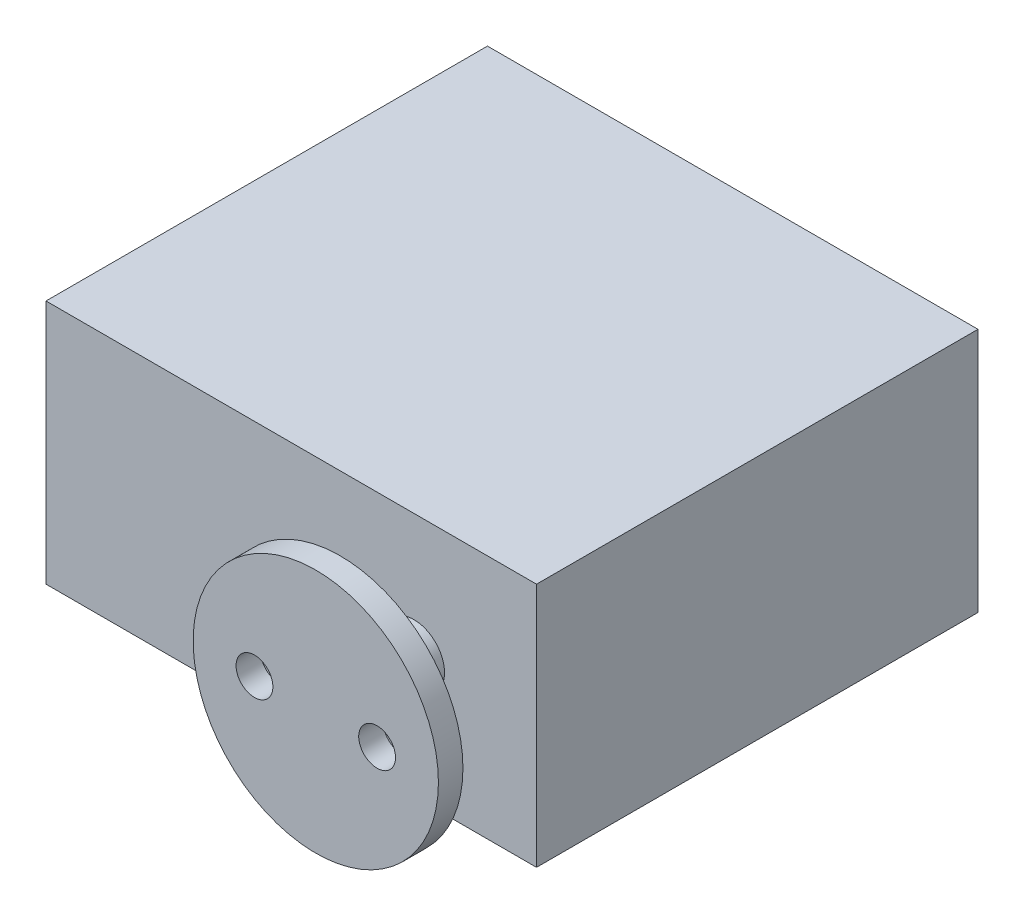
ISO-10303-21;
HEADER;
FILE_DESCRIPTION(('STEP AP214'),'2;1');
FILE_NAME('part.step','',(''),(''),'','','');
FILE_SCHEMA(('AUTOMOTIVE_DESIGN { 1 0 10303 214 1 1 1 1 }'));
ENDSEC;
DATA;
#1=APPLICATION_CONTEXT('core data for automotive mechanical design processes');
#2=APPLICATION_PROTOCOL_DEFINITION('international standard','automotive_design',2000,#1);
#3=PRODUCT_CONTEXT('',#1,'mechanical');
#4=PRODUCT('Part','Part','',(#3));
#5=PRODUCT_RELATED_PRODUCT_CATEGORY('part','',(#4));
#6=PRODUCT_DEFINITION_FORMATION('','',#4);
#7=PRODUCT_DEFINITION_CONTEXT('part definition',#1,'design');
#8=PRODUCT_DEFINITION('design','',#6,#7);
#9=PRODUCT_DEFINITION_SHAPE('','',#8);
#10=(LENGTH_UNIT() NAMED_UNIT(*) SI_UNIT(.MILLI.,.METRE.));
#11=(NAMED_UNIT(*) PLANE_ANGLE_UNIT() SI_UNIT($,.RADIAN.));
#12=(NAMED_UNIT(*) SI_UNIT($,.STERADIAN.) SOLID_ANGLE_UNIT());
#13=UNCERTAINTY_MEASURE_WITH_UNIT(LENGTH_MEASURE(1.E-05),#10,'distance_accuracy_value','');
#14=(GEOMETRIC_REPRESENTATION_CONTEXT(3) GLOBAL_UNCERTAINTY_ASSIGNED_CONTEXT((#13)) GLOBAL_UNIT_ASSIGNED_CONTEXT((#10,
#11,#12)) REPRESENTATION_CONTEXT('',''));
#15=CARTESIAN_POINT('',(0.,0.,0.));
#16=DIRECTION('',(0.,0.,1.));
#17=DIRECTION('',(1.,0.,0.));
#18=AXIS2_PLACEMENT_3D('',#15,#16,#17);
#19=CARTESIAN_POINT('',(-20.,10.,36.));
#20=DIRECTION('',(1.,0.,0.));
#21=DIRECTION('',(0.,1.,0.));
#22=AXIS2_PLACEMENT_3D('',#19,#20,#21);
#23=PLANE('',#22);
#24=DIRECTION('',(0.,-1.,0.));
#25=VECTOR('',#24,1.);
#26=CARTESIAN_POINT('',(-20.,10.,0.));
#27=LINE('',#26,#25);
#28=CARTESIAN_POINT('',(-20.,10.,0.));
#29=VERTEX_POINT('',#28);
#30=CARTESIAN_POINT('',(-20.,-10.,0.));
#31=VERTEX_POINT('',#30);
#32=EDGE_CURVE('E110',#29,#31,#27,.T.);
#33=ORIENTED_EDGE('',*,*,#32,.T.);
#34=DIRECTION('',(0.,0.,-1.));
#35=VECTOR('',#34,1.);
#36=CARTESIAN_POINT('',(-20.,-10.,36.));
#37=LINE('',#36,#35);
#38=CARTESIAN_POINT('',(-20.,-10.,36.));
#39=VERTEX_POINT('',#38);
#40=EDGE_CURVE('E48',#39,#31,#37,.T.);
#41=ORIENTED_EDGE('',*,*,#40,.F.);
#42=DIRECTION('',(0.,-1.,0.));
#43=VECTOR('',#42,1.);
#44=CARTESIAN_POINT('',(-20.,10.,36.));
#45=LINE('',#44,#43);
#46=CARTESIAN_POINT('',(-20.,10.,36.));
#47=VERTEX_POINT('',#46);
#48=EDGE_CURVE('E92',#47,#39,#45,.T.);
#49=ORIENTED_EDGE('',*,*,#48,.F.);
#50=DIRECTION('',(0.,0.,-1.));
#51=VECTOR('',#50,1.);
#52=CARTESIAN_POINT('',(-20.,10.,36.));
#53=LINE('',#52,#51);
#54=EDGE_CURVE('E106',#47,#29,#53,.T.);
#55=ORIENTED_EDGE('',*,*,#54,.T.);
#56=EDGE_LOOP('',(#33,#41,#49,#55));
#57=FACE_BOUND('',#56,.T.);
#58=ADVANCED_FACE('F39',(#57),#23,.F.);
#59=CARTESIAN_POINT('',(20.,-10.,36.));
#60=DIRECTION('',(0.,1.,0.));
#61=DIRECTION('',(-1.,0.,0.));
#62=AXIS2_PLACEMENT_3D('',#59,#60,#61);
#63=PLANE('',#62);
#64=DIRECTION('',(1.,0.,0.));
#65=VECTOR('',#64,1.);
#66=CARTESIAN_POINT('',(20.,-10.,0.));
#67=LINE('',#66,#65);
#68=CARTESIAN_POINT('',(20.,-10.,0.));
#69=VERTEX_POINT('',#68);
#70=EDGE_CURVE('E98',#31,#69,#67,.T.);
#71=ORIENTED_EDGE('',*,*,#70,.T.);
#72=DIRECTION('',(0.,0.,-1.));
#73=VECTOR('',#72,1.);
#74=CARTESIAN_POINT('',(20.,-10.,36.));
#75=LINE('',#74,#73);
#76=CARTESIAN_POINT('',(20.,-10.,36.));
#77=VERTEX_POINT('',#76);
#78=EDGE_CURVE('E96',#77,#69,#75,.T.);
#79=ORIENTED_EDGE('',*,*,#78,.F.);
#80=DIRECTION('',(1.,0.,0.));
#81=VECTOR('',#80,1.);
#82=CARTESIAN_POINT('',(20.,-10.,36.));
#83=LINE('',#82,#81);
#84=EDGE_CURVE('E87',#39,#77,#83,.T.);
#85=ORIENTED_EDGE('',*,*,#84,.F.);
#86=ORIENTED_EDGE('',*,*,#40,.T.);
#87=EDGE_LOOP('',(#71,#79,#85,#86));
#88=FACE_BOUND('',#87,.T.);
#89=ADVANCED_FACE('F97',(#88),#63,.F.);
#90=CARTESIAN_POINT('',(20.,10.,36.));
#91=DIRECTION('',(-1.,0.,0.));
#92=DIRECTION('',(0.,0.,1.));
#93=AXIS2_PLACEMENT_3D('',#90,#91,#92);
#94=PLANE('',#93);
#95=DIRECTION('',(0.,1.,0.));
#96=VECTOR('',#95,1.);
#97=CARTESIAN_POINT('',(20.,10.,0.));
#98=LINE('',#97,#96);
#99=CARTESIAN_POINT('',(20.,10.,0.));
#100=VERTEX_POINT('',#99);
#101=EDGE_CURVE('E73',#69,#100,#98,.T.);
#102=ORIENTED_EDGE('',*,*,#101,.T.);
#103=DIRECTION('',(0.,0.,-1.));
#104=VECTOR('',#103,1.);
#105=CARTESIAN_POINT('',(20.,10.,36.));
#106=LINE('',#105,#104);
#107=CARTESIAN_POINT('',(20.,10.,36.));
#108=VERTEX_POINT('',#107);
#109=EDGE_CURVE('E100',#108,#100,#106,.T.);
#110=ORIENTED_EDGE('',*,*,#109,.F.);
#111=DIRECTION('',(0.,1.,0.));
#112=VECTOR('',#111,1.);
#113=CARTESIAN_POINT('',(20.,10.,36.));
#114=LINE('',#113,#112);
#115=EDGE_CURVE('E90',#77,#108,#114,.T.);
#116=ORIENTED_EDGE('',*,*,#115,.F.);
#117=ORIENTED_EDGE('',*,*,#78,.T.);
#118=EDGE_LOOP('',(#102,#110,#116,#117));
#119=FACE_BOUND('',#118,.T.);
#120=ADVANCED_FACE('F102',(#119),#94,.F.);
#121=CARTESIAN_POINT('',(20.,10.,36.));
#122=DIRECTION('',(0.,-1.,0.));
#123=DIRECTION('',(1.,0.,0.));
#124=AXIS2_PLACEMENT_3D('',#121,#122,#123);
#125=PLANE('',#124);
#126=DIRECTION('',(-1.,0.,0.));
#127=VECTOR('',#126,1.);
#128=CARTESIAN_POINT('',(20.,10.,0.));
#129=LINE('',#128,#127);
#130=EDGE_CURVE('E79',#100,#29,#129,.T.);
#131=ORIENTED_EDGE('',*,*,#130,.T.);
#132=ORIENTED_EDGE('',*,*,#54,.F.);
#133=DIRECTION('',(-1.,0.,0.));
#134=VECTOR('',#133,1.);
#135=CARTESIAN_POINT('',(20.,10.,36.));
#136=LINE('',#135,#134);
#137=EDGE_CURVE('E56',#108,#47,#136,.T.);
#138=ORIENTED_EDGE('',*,*,#137,.F.);
#139=ORIENTED_EDGE('',*,*,#109,.T.);
#140=EDGE_LOOP('',(#131,#132,#138,#139));
#141=FACE_BOUND('',#140,.T.);
#142=ADVANCED_FACE('F139',(#141),#125,.F.);
#143=CARTESIAN_POINT('',(0.,0.,36.));
#144=DIRECTION('',(0.,0.,-1.));
#145=DIRECTION('',(-1.,0.,0.));
#146=AXIS2_PLACEMENT_3D('',#143,#144,#145);
#147=PLANE('',#146);
#148=CARTESIAN_POINT('',(10.,0.,36.));
#149=DIRECTION('',(0.,0.,-1.));
#150=DIRECTION('',(-1.,0.,0.));
#151=AXIS2_PLACEMENT_3D('',#148,#149,#150);
#152=CIRCLE('',#151,2.5);
#153=CARTESIAN_POINT('',(7.5,0.,36.));
#154=VERTEX_POINT('',#153);
#155=EDGE_CURVE('E11',#154,#154,#152,.F.);
#156=ORIENTED_EDGE('',*,*,#155,.F.);
#157=EDGE_LOOP('',(#156));
#158=FACE_BOUND('',#157,.T.);
#159=ORIENTED_EDGE('',*,*,#48,.T.);
#160=ORIENTED_EDGE('',*,*,#84,.T.);
#161=ORIENTED_EDGE('',*,*,#115,.T.);
#162=ORIENTED_EDGE('',*,*,#137,.T.);
#163=EDGE_LOOP('',(#159,#160,#161,#162));
#164=FACE_BOUND('',#163,.T.);
#165=ADVANCED_FACE('F88',(#158,#164),#147,.F.);
#166=CARTESIAN_POINT('',(0.,0.,0.));
#167=DIRECTION('',(0.,0.,-1.));
#168=DIRECTION('',(-1.,0.,0.));
#169=AXIS2_PLACEMENT_3D('',#166,#167,#168);
#170=PLANE('',#169);
#171=ORIENTED_EDGE('',*,*,#32,.F.);
#172=ORIENTED_EDGE('',*,*,#130,.F.);
#173=ORIENTED_EDGE('',*,*,#101,.F.);
#174=ORIENTED_EDGE('',*,*,#70,.F.);
#175=EDGE_LOOP('',(#171,#172,#173,#174));
#176=FACE_BOUND('',#175,.T.);
#177=ADVANCED_FACE('F128',(#176),#170,.T.);
#178=CARTESIAN_POINT('',(10.,0.,42.));
#179=DIRECTION('',(0.,0.,-1.));
#180=DIRECTION('',(-1.,0.,0.));
#181=AXIS2_PLACEMENT_3D('',#178,#179,#180);
#182=CYLINDRICAL_SURFACE('',#181,2.5);
#183=CARTESIAN_POINT('',(10.,0.,42.));
#184=DIRECTION('',(0.,0.,1.));
#185=DIRECTION('',(1.,0.,0.));
#186=AXIS2_PLACEMENT_3D('',#183,#184,#185);
#187=CIRCLE('',#186,2.5);
#188=CARTESIAN_POINT('',(12.5,0.,42.));
#189=VERTEX_POINT('',#188);
#190=EDGE_CURVE('E114',#189,#189,#187,.T.);
#191=ORIENTED_EDGE('',*,*,#190,.F.);
#192=EDGE_LOOP('',(#191));
#193=FACE_BOUND('',#192,.T.);
#194=ORIENTED_EDGE('',*,*,#155,.T.);
#195=EDGE_LOOP('',(#194));
#196=FACE_BOUND('',#195,.T.);
#197=ADVANCED_FACE('F130',(#193,#196),#182,.T.);
#198=CARTESIAN_POINT('',(10.,0.,44.));
#199=DIRECTION('',(0.,0.,1.));
#200=DIRECTION('',(1.,0.,0.));
#201=AXIS2_PLACEMENT_3D('',#198,#199,#200);
#202=PLANE('',#201);
#203=CARTESIAN_POINT('',(5.,0.,44.));
#204=DIRECTION('',(0.,0.,1.));
#205=DIRECTION('',(1.,0.,0.));
#206=AXIS2_PLACEMENT_3D('',#203,#204,#205);
#207=CIRCLE('',#206,1.5);
#208=CARTESIAN_POINT('',(6.5,0.,44.));
#209=VERTEX_POINT('',#208);
#210=EDGE_CURVE('E235',#209,#209,#207,.T.);
#211=ORIENTED_EDGE('',*,*,#210,.F.);
#212=EDGE_LOOP('',(#211));
#213=FACE_BOUND('',#212,.T.);
#214=CARTESIAN_POINT('',(10.,0.,44.));
#215=DIRECTION('',(0.,0.,1.));
#216=DIRECTION('',(1.,0.,0.));
#217=AXIS2_PLACEMENT_3D('',#214,#215,#216);
#218=CIRCLE('',#217,10.);
#219=CARTESIAN_POINT('',(20.,0.,44.));
#220=VERTEX_POINT('',#219);
#221=EDGE_CURVE('E243',#220,#220,#218,.T.);
#222=ORIENTED_EDGE('',*,*,#221,.T.);
#223=EDGE_LOOP('',(#222));
#224=FACE_BOUND('',#223,.T.);
#225=CARTESIAN_POINT('',(15.,0.,44.));
#226=DIRECTION('',(0.,0.,1.));
#227=DIRECTION('',(1.,0.,0.));
#228=AXIS2_PLACEMENT_3D('',#225,#226,#227);
#229=CIRCLE('',#228,1.5);
#230=CARTESIAN_POINT('',(16.5,0.,44.));
#231=VERTEX_POINT('',#230);
#232=EDGE_CURVE('E224',#231,#231,#229,.T.);
#233=ORIENTED_EDGE('',*,*,#232,.F.);
#234=EDGE_LOOP('',(#233));
#235=FACE_BOUND('',#234,.T.);
#236=ADVANCED_FACE('F136',(#213,#224,#235),#202,.T.);
#237=CARTESIAN_POINT('',(10.,0.,42.));
#238=DIRECTION('',(0.,0.,1.));
#239=DIRECTION('',(1.,0.,0.));
#240=AXIS2_PLACEMENT_3D('',#237,#238,#239);
#241=PLANE('',#240);
#242=ORIENTED_EDGE('',*,*,#190,.T.);
#243=EDGE_LOOP('',(#242));
#244=FACE_BOUND('',#243,.T.);
#245=CARTESIAN_POINT('',(10.,0.,42.));
#246=DIRECTION('',(0.,0.,1.));
#247=DIRECTION('',(1.,0.,0.));
#248=AXIS2_PLACEMENT_3D('',#245,#246,#247);
#249=CIRCLE('',#248,10.);
#250=CARTESIAN_POINT('',(20.,0.,42.));
#251=VERTEX_POINT('',#250);
#252=EDGE_CURVE('E239',#251,#251,#249,.T.);
#253=ORIENTED_EDGE('',*,*,#252,.F.);
#254=EDGE_LOOP('',(#253));
#255=FACE_BOUND('',#254,.T.);
#256=CARTESIAN_POINT('',(5.,0.,42.));
#257=DIRECTION('',(0.,0.,1.));
#258=DIRECTION('',(1.,0.,0.));
#259=AXIS2_PLACEMENT_3D('',#256,#257,#258);
#260=CIRCLE('',#259,1.5);
#261=CARTESIAN_POINT('',(6.5,0.,42.));
#262=VERTEX_POINT('',#261);
#263=EDGE_CURVE('E232',#262,#262,#260,.T.);
#264=ORIENTED_EDGE('',*,*,#263,.T.);
#265=EDGE_LOOP('',(#264));
#266=FACE_BOUND('',#265,.T.);
#267=CARTESIAN_POINT('',(15.,0.,42.));
#268=DIRECTION('',(0.,0.,1.));
#269=DIRECTION('',(1.,0.,0.));
#270=AXIS2_PLACEMENT_3D('',#267,#268,#269);
#271=CIRCLE('',#270,1.5);
#272=CARTESIAN_POINT('',(16.5,0.,42.));
#273=VERTEX_POINT('',#272);
#274=EDGE_CURVE('E227',#273,#273,#271,.T.);
#275=ORIENTED_EDGE('',*,*,#274,.T.);
#276=EDGE_LOOP('',(#275));
#277=FACE_BOUND('',#276,.T.);
#278=ADVANCED_FACE('F177',(#244,#255,#266,#277),#241,.F.);
#279=CARTESIAN_POINT('',(10.,0.,44.));
#280=DIRECTION('',(0.,0.,-1.));
#281=DIRECTION('',(-1.,0.,0.));
#282=AXIS2_PLACEMENT_3D('',#279,#280,#281);
#283=CYLINDRICAL_SURFACE('',#282,10.);
#284=ORIENTED_EDGE('',*,*,#221,.F.);
#285=EDGE_LOOP('',(#284));
#286=FACE_BOUND('',#285,.T.);
#287=ORIENTED_EDGE('',*,*,#252,.T.);
#288=EDGE_LOOP('',(#287));
#289=FACE_BOUND('',#288,.T.);
#290=ADVANCED_FACE('F187',(#286,#289),#283,.T.);
#291=CARTESIAN_POINT('',(5.,0.,44.));
#292=DIRECTION('',(0.,0.,-1.));
#293=DIRECTION('',(-1.,0.,0.));
#294=AXIS2_PLACEMENT_3D('',#291,#292,#293);
#295=CYLINDRICAL_SURFACE('',#294,1.5);
#296=ORIENTED_EDGE('',*,*,#210,.T.);
#297=EDGE_LOOP('',(#296));
#298=FACE_BOUND('',#297,.T.);
#299=ORIENTED_EDGE('',*,*,#263,.F.);
#300=EDGE_LOOP('',(#299));
#301=FACE_BOUND('',#300,.T.);
#302=ADVANCED_FACE('F197',(#298,#301),#295,.F.);
#303=CARTESIAN_POINT('',(15.,0.,44.));
#304=DIRECTION('',(0.,0.,-1.));
#305=DIRECTION('',(-1.,0.,0.));
#306=AXIS2_PLACEMENT_3D('',#303,#304,#305);
#307=CYLINDRICAL_SURFACE('',#306,1.5);
#308=ORIENTED_EDGE('',*,*,#232,.T.);
#309=EDGE_LOOP('',(#308));
#310=FACE_BOUND('',#309,.T.);
#311=ORIENTED_EDGE('',*,*,#274,.F.);
#312=EDGE_LOOP('',(#311));
#313=FACE_BOUND('',#312,.T.);
#314=ADVANCED_FACE('F207',(#310,#313),#307,.F.);
#315=CLOSED_SHELL('',(#58,#89,#120,#142,#165,#177,#197,#236,#278,#290,#302,#314));
#316=MANIFOLD_SOLID_BREP('B2',#315);
#317=ADVANCED_BREP_SHAPE_REPRESENTATION('',(#18,#316),#14);
#318=SHAPE_DEFINITION_REPRESENTATION(#9,#317);
ENDSEC;
END-ISO-10303-21;
